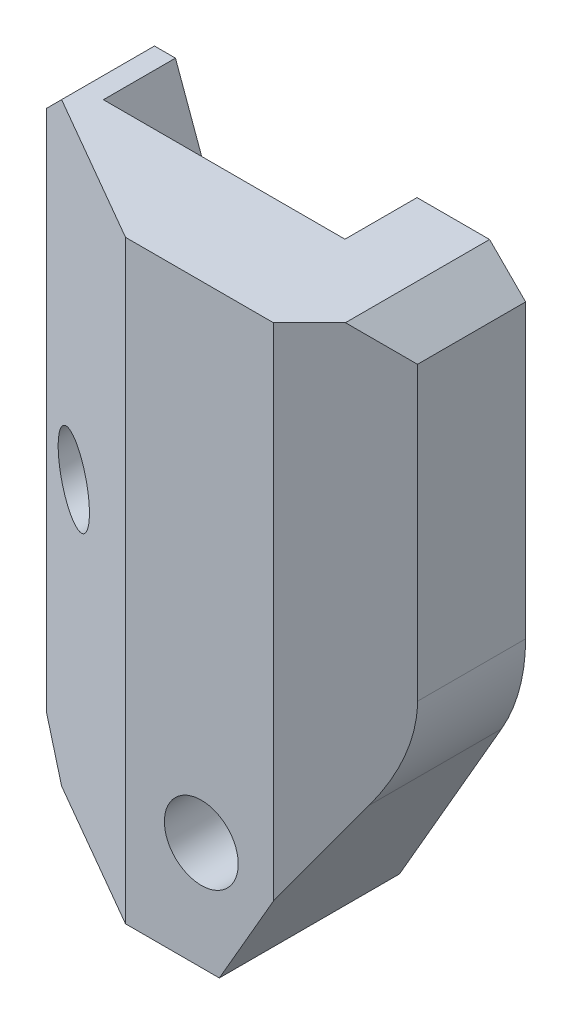
ISO-10303-21;
HEADER;
FILE_DESCRIPTION(('STEP AP214'),'2;1');
FILE_NAME('part.step','',(''),(''),'','','');
FILE_SCHEMA(('AUTOMOTIVE_DESIGN { 1 0 10303 214 1 1 1 1 }'));
ENDSEC;
DATA;
#1=APPLICATION_CONTEXT('core data for automotive mechanical design processes');
#2=APPLICATION_PROTOCOL_DEFINITION('international standard','automotive_design',2000,#1);
#3=PRODUCT_CONTEXT('',#1,'mechanical');
#4=PRODUCT('Part','Part','',(#3));
#5=PRODUCT_RELATED_PRODUCT_CATEGORY('part','',(#4));
#6=PRODUCT_DEFINITION_FORMATION('','',#4);
#7=PRODUCT_DEFINITION_CONTEXT('part definition',#1,'design');
#8=PRODUCT_DEFINITION('design','',#6,#7);
#9=PRODUCT_DEFINITION_SHAPE('','',#8);
#10=(LENGTH_UNIT() NAMED_UNIT(*) SI_UNIT(.MILLI.,.METRE.));
#11=(NAMED_UNIT(*) PLANE_ANGLE_UNIT() SI_UNIT($,.RADIAN.));
#12=(NAMED_UNIT(*) SI_UNIT($,.STERADIAN.) SOLID_ANGLE_UNIT());
#13=UNCERTAINTY_MEASURE_WITH_UNIT(LENGTH_MEASURE(1.E-05),#10,'distance_accuracy_value','');
#14=(GEOMETRIC_REPRESENTATION_CONTEXT(3) GLOBAL_UNCERTAINTY_ASSIGNED_CONTEXT((#13)) GLOBAL_UNIT_ASSIGNED_CONTEXT((#10,
#11,#12)) REPRESENTATION_CONTEXT('',''));
#15=CARTESIAN_POINT('',(0.,0.,0.));
#16=DIRECTION('',(0.,0.,1.));
#17=DIRECTION('',(1.,0.,0.));
#18=AXIS2_PLACEMENT_3D('',#15,#16,#17);
#19=CARTESIAN_POINT('',(-2.49999999999986,-10.,5.));
#20=DIRECTION('',(0.,1.,0.));
#21=DIRECTION('',(0.,0.,1.));
#22=AXIS2_PLACEMENT_3D('',#19,#20,#21);
#23=PLANE('',#22);
#24=DIRECTION('',(0.866025403784436,0.,0.500000000000004));
#25=VECTOR('',#24,1.);
#26=CARTESIAN_POINT('',(-8.79999999999985,-10.,2.));
#27=LINE('',#26,#25);
#28=CARTESIAN_POINT('',(-7.79999999999993,-10.,2.57735026918966));
#29=VERTEX_POINT('',#28);
#30=CARTESIAN_POINT('',(-3.60384757729336,-10.,5.00000000000002));
#31=VERTEX_POINT('',#30);
#32=EDGE_CURVE('E163',#29,#31,#27,.T.);
#33=ORIENTED_EDGE('',*,*,#32,.F.);
#34=DIRECTION('',(0.,0.,-1.));
#35=VECTOR('',#34,1.);
#36=CARTESIAN_POINT('',(-7.79999999999993,-10.,0.));
#37=LINE('',#36,#35);
#38=CARTESIAN_POINT('',(-7.79999999999993,-10.,0.));
#39=VERTEX_POINT('',#38);
#40=EDGE_CURVE('E293',#29,#39,#37,.T.);
#41=ORIENTED_EDGE('',*,*,#40,.T.);
#42=DIRECTION('',(1.,0.,0.));
#43=VECTOR('',#42,1.);
#44=CARTESIAN_POINT('',(-2.49999999999993,-10.,0.));
#45=LINE('',#44,#43);
#46=CARTESIAN_POINT('',(-0.999999999999945,-10.,0.));
#47=VERTEX_POINT('',#46);
#48=EDGE_CURVE('E235',#39,#47,#45,.T.);
#49=ORIENTED_EDGE('',*,*,#48,.T.);
#50=DIRECTION('',(0.,0.,1.));
#51=VECTOR('',#50,1.);
#52=CARTESIAN_POINT('',(-0.999999999999945,-10.,5.));
#53=LINE('',#52,#51);
#54=CARTESIAN_POINT('',(-0.999999999999945,-10.,5.));
#55=VERTEX_POINT('',#54);
#56=EDGE_CURVE('E261',#47,#55,#53,.T.);
#57=ORIENTED_EDGE('',*,*,#56,.T.);
#58=DIRECTION('',(1.,0.,0.));
#59=VECTOR('',#58,1.);
#60=CARTESIAN_POINT('',(-2.49999999999986,-10.,5.));
#61=LINE('',#60,#59);
#62=EDGE_CURVE('E236',#31,#55,#61,.T.);
#63=ORIENTED_EDGE('',*,*,#62,.F.);
#64=EDGE_LOOP('',(#33,#41,#49,#57,#63));
#65=FACE_BOUND('',#64,.T.);
#66=ADVANCED_FACE('F38',(#65),#23,.F.);
#67=CARTESIAN_POINT('',(2.50000000000007,10.,5.));
#68=DIRECTION('',(-1.,0.,0.));
#69=DIRECTION('',(0.,0.,1.));
#70=AXIS2_PLACEMENT_3D('',#67,#68,#69);
#71=PLANE('',#70);
#72=DIRECTION('',(0.,-1.,0.));
#73=VECTOR('',#72,1.);
#74=CARTESIAN_POINT('',(2.50000000000007,-10.,3.00000000000001));
#75=LINE('',#74,#73);
#76=CARTESIAN_POINT('',(2.49999999999999,5.50000000000001,2.99999999999999));
#77=VERTEX_POINT('',#76);
#78=CARTESIAN_POINT('',(2.50000000000007,-2.59807621135331,3.00000000000001));
#79=VERTEX_POINT('',#78);
#80=EDGE_CURVE('E245',#77,#79,#75,.T.);
#81=ORIENTED_EDGE('',*,*,#80,.T.);
#82=DIRECTION('',(0.,0.,1.));
#83=VECTOR('',#82,1.);
#84=CARTESIAN_POINT('',(2.50000000000007,-2.59807621135332,0.));
#85=LINE('',#84,#83);
#86=CARTESIAN_POINT('',(2.50000000000007,-2.59807621135332,0.));
#87=VERTEX_POINT('',#86);
#88=EDGE_CURVE('E295',#79,#87,#85,.F.);
#89=ORIENTED_EDGE('',*,*,#88,.T.);
#90=DIRECTION('',(0.,1.,0.));
#91=VECTOR('',#90,1.);
#92=CARTESIAN_POINT('',(2.50000000000007,10.,0.));
#93=LINE('',#92,#91);
#94=CARTESIAN_POINT('',(2.49999999999999,5.50000000000001,0.));
#95=VERTEX_POINT('',#94);
#96=EDGE_CURVE('E238',#87,#95,#93,.T.);
#97=ORIENTED_EDGE('',*,*,#96,.T.);
#98=DIRECTION('',(0.,0.,1.));
#99=VECTOR('',#98,1.);
#100=CARTESIAN_POINT('',(2.49999999999999,5.49999999999998,5.00000000000002));
#101=LINE('',#100,#99);
#102=EDGE_CURVE('E268',#95,#77,#101,.T.);
#103=ORIENTED_EDGE('',*,*,#102,.T.);
#104=EDGE_LOOP('',(#81,#89,#97,#103));
#105=FACE_BOUND('',#104,.T.);
#106=ADVANCED_FACE('F300',(#105),#71,.F.);
#107=CARTESIAN_POINT('',(-2.49999999999986,-10.,5.));
#108=DIRECTION('',(0.,0.,1.));
#109=DIRECTION('',(1.,0.,0.));
#110=AXIS2_PLACEMENT_3D('',#107,#108,#109);
#111=PLANE('',#110);
#112=DIRECTION('',(0.,1.,0.));
#113=VECTOR('',#112,1.);
#114=CARTESIAN_POINT('',(-3.60384757729343,-16.,5.00000000000002));
#115=LINE('',#114,#113);
#116=CARTESIAN_POINT('',(-3.60384757729335,6.49999999999999,5.));
#117=VERTEX_POINT('',#116);
#118=EDGE_CURVE('E156',#31,#117,#115,.T.);
#119=ORIENTED_EDGE('',*,*,#118,.F.);
#120=ORIENTED_EDGE('',*,*,#62,.T.);
#121=DIRECTION('',(-0.500000000000001,-0.866025403784438,0.));
#122=VECTOR('',#121,1.);
#123=CARTESIAN_POINT('',(-1.37499999999995,-10.6495190528383,5.));
#124=LINE('',#123,#122);
#125=CARTESIAN_POINT('',(0.500000000000153,-7.40192378864667,5.00000000000002));
#126=VERTEX_POINT('',#125);
#127=EDGE_CURVE('E264',#55,#126,#124,.F.);
#128=ORIENTED_EDGE('',*,*,#127,.T.);
#129=DIRECTION('',(0.,1.,0.));
#130=VECTOR('',#129,1.);
#131=CARTESIAN_POINT('',(0.500000000000139,9.99999999999999,5.00000000000002));
#132=LINE('',#131,#130);
#133=CARTESIAN_POINT('',(0.50000000000007,6.49999999999998,5.00000000000002));
#134=VERTEX_POINT('',#133);
#135=EDGE_CURVE('E181',#126,#134,#132,.T.);
#136=ORIENTED_EDGE('',*,*,#135,.T.);
#137=DIRECTION('',(1.,0.,0.));
#138=VECTOR('',#137,1.);
#139=CARTESIAN_POINT('',(-9.29999999999993,6.49999999999998,5.00000000000002));
#140=LINE('',#139,#138);
#141=EDGE_CURVE('E172',#117,#134,#140,.T.);
#142=ORIENTED_EDGE('',*,*,#141,.F.);
#143=EDGE_LOOP('',(#119,#120,#128,#136,#142));
#144=FACE_BOUND('',#143,.T.);
#145=CARTESIAN_POINT('',(-1.49999999999985,-7.00000000000001,5.));
#146=DIRECTION('',(0.,0.,1.));
#147=DIRECTION('',(1.,0.,0.));
#148=AXIS2_PLACEMENT_3D('',#145,#146,#147);
#149=CIRCLE('',#148,1.02499999999999);
#150=CARTESIAN_POINT('',(-0.474999999999859,-7.00000000000001,5.));
#151=VERTEX_POINT('',#150);
#152=EDGE_CURVE('E222',#151,#151,#149,.T.);
#153=ORIENTED_EDGE('',*,*,#152,.F.);
#154=EDGE_LOOP('',(#153));
#155=FACE_BOUND('',#154,.T.);
#156=ADVANCED_FACE('F178',(#144,#155),#111,.T.);
#157=CARTESIAN_POINT('',(-2.49999999999993,-10.,0.));
#158=DIRECTION('',(0.,0.,1.));
#159=DIRECTION('',(1.,0.,0.));
#160=AXIS2_PLACEMENT_3D('',#157,#158,#159);
#161=PLANE('',#160);
#162=ORIENTED_EDGE('',*,*,#96,.F.);
#163=CARTESIAN_POINT('',(-2.5,-2.59807621135331,0.));
#164=DIRECTION('',(0.,0.,1.));
#165=DIRECTION('',(1.,0.,0.));
#166=AXIS2_PLACEMENT_3D('',#163,#164,#165);
#167=CIRCLE('',#166,5.);
#168=CARTESIAN_POINT('',(1.83012701892221,-5.09807621135333,0.));
#169=VERTEX_POINT('',#168);
#170=EDGE_CURVE('E60',#87,#169,#167,.F.);
#171=ORIENTED_EDGE('',*,*,#170,.T.);
#172=DIRECTION('',(0.500000000000001,0.866025403784438,0.));
#173=VECTOR('',#172,1.);
#174=CARTESIAN_POINT('',(2.50000000000006,-3.93782217350894,0.));
#175=LINE('',#174,#173);
#176=EDGE_CURVE('E259',#169,#47,#175,.F.);
#177=ORIENTED_EDGE('',*,*,#176,.T.);
#178=ORIENTED_EDGE('',*,*,#48,.F.);
#179=DIRECTION('',(-0.707106781186548,0.707106781186547,0.));
#180=VECTOR('',#179,1.);
#181=CARTESIAN_POINT('',(-8.79999999999992,-9.,0.));
#182=LINE('',#181,#180);
#183=CARTESIAN_POINT('',(-8.79999999999992,-9.,0.));
#184=VERTEX_POINT('',#183);
#185=EDGE_CURVE('E276',#39,#184,#182,.T.);
#186=ORIENTED_EDGE('',*,*,#185,.T.);
#187=DIRECTION('',(0.,-1.,0.));
#188=VECTOR('',#187,1.);
#189=CARTESIAN_POINT('',(-8.79999999999993,6.50000000000001,0.));
#190=LINE('',#189,#188);
#191=CARTESIAN_POINT('',(-8.79999999999985,5.50000000000001,0.));
#192=VERTEX_POINT('',#191);
#193=EDGE_CURVE('E184',#192,#184,#190,.T.);
#194=ORIENTED_EDGE('',*,*,#193,.F.);
#195=DIRECTION('',(0.70710678118655,0.707106781186546,0.));
#196=VECTOR('',#195,1.);
#197=CARTESIAN_POINT('',(-8.79999999999985,5.50000000000001,0.));
#198=LINE('',#197,#196);
#199=CARTESIAN_POINT('',(-7.8,6.50000000000001,0.));
#200=VERTEX_POINT('',#199);
#201=EDGE_CURVE('E278',#192,#200,#198,.T.);
#202=ORIENTED_EDGE('',*,*,#201,.T.);
#203=DIRECTION('',(-1.,0.,0.));
#204=VECTOR('',#203,1.);
#205=CARTESIAN_POINT('',(-9.29999999999993,6.5,0.));
#206=LINE('',#205,#204);
#207=CARTESIAN_POINT('',(-7.21796650602938,6.50000000000002,0.));
#208=VERTEX_POINT('',#207);
#209=EDGE_CURVE('E183',#208,#200,#206,.T.);
#210=ORIENTED_EDGE('',*,*,#209,.F.);
#211=DIRECTION('',(-0.342020143325669,0.939692620785908,0.));
#212=VECTOR('',#211,1.);
#213=CARTESIAN_POINT('',(-5.99912240044105,3.15125334206073,0.));
#214=LINE('',#213,#212);
#215=CARTESIAN_POINT('',(-3.53657736849615,-3.61453352759782,0.));
#216=VERTEX_POINT('',#215);
#217=EDGE_CURVE('E216',#216,#208,#214,.T.);
#218=ORIENTED_EDGE('',*,*,#217,.F.);
#219=CARTESIAN_POINT('',(-2.59688474771032,-3.27251338427215,0.));
#220=DIRECTION('',(0.,0.,-1.));
#221=DIRECTION('',(1.,0.,0.));
#222=AXIS2_PLACEMENT_3D('',#219,#220,#221);
#223=CIRCLE('',#222,1.);
#224=CARTESIAN_POINT('',(-2.25486460438473,-4.21220600505806,0.));
#225=VERTEX_POINT('',#224);
#226=EDGE_CURVE('E213',#225,#216,#223,.T.);
#227=ORIENTED_EDGE('',*,*,#226,.F.);
#228=DIRECTION('',(-0.939692620785908,-0.34202014332567,0.));
#229=VECTOR('',#228,1.);
#230=CARTESIAN_POINT('',(-2.25486460438473,-4.21220600505806,0.));
#231=LINE('',#230,#229);
#232=CARTESIAN_POINT('',(1.78581366499475,-2.74151938875768,0.));
#233=VERTEX_POINT('',#232);
#234=EDGE_CURVE('E210',#233,#225,#231,.T.);
#235=ORIENTED_EDGE('',*,*,#234,.F.);
#236=CARTESIAN_POINT('',(1.44379352166908,-1.80182676797176,0.));
#237=DIRECTION('',(0.,0.,-1.));
#238=DIRECTION('',(1.,0.,0.));
#239=AXIS2_PLACEMENT_3D('',#236,#237,#238);
#240=CIRCLE('',#239,1.);
#241=CARTESIAN_POINT('',(2.383486142455,-1.4598066246461,0.));
#242=VERTEX_POINT('',#241);
#243=EDGE_CURVE('E193',#242,#233,#240,.T.);
#244=ORIENTED_EDGE('',*,*,#243,.F.);
#245=DIRECTION('',(0.342020143325669,-0.939692620785908,0.));
#246=VECTOR('',#245,1.);
#247=CARTESIAN_POINT('',(2.383486142455,-1.4598066246461,0.));
#248=LINE('',#247,#246);
#249=CARTESIAN_POINT('',(-0.513646539431117,6.50000000000001,0.));
#250=VERTEX_POINT('',#249);
#251=EDGE_CURVE('E198',#250,#242,#248,.T.);
#252=ORIENTED_EDGE('',*,*,#251,.F.);
#253=CARTESIAN_POINT('',(1.50000000000014,6.5,0.));
#254=VERTEX_POINT('',#253);
#255=EDGE_CURVE('E186',#254,#250,#206,.T.);
#256=ORIENTED_EDGE('',*,*,#255,.F.);
#257=DIRECTION('',(-0.707106781186549,0.707106781186546,0.));
#258=VECTOR('',#257,1.);
#259=CARTESIAN_POINT('',(2.49999999999999,5.50000000000001,0.));
#260=LINE('',#259,#258);
#261=EDGE_CURVE('E280',#254,#95,#260,.F.);
#262=ORIENTED_EDGE('',*,*,#261,.T.);
#263=EDGE_LOOP('',(#162,#171,#177,#178,#186,#194,#202,#210,#218,#227,#235,#244,#252,#256,#262));
#264=FACE_BOUND('',#263,.T.);
#265=CARTESIAN_POINT('',(-1.49999999999985,-7.00000000000001,0.));
#266=DIRECTION('',(0.,0.,1.));
#267=DIRECTION('',(1.,0.,0.));
#268=AXIS2_PLACEMENT_3D('',#265,#266,#267);
#269=CIRCLE('',#268,1.02499999999999);
#270=CARTESIAN_POINT('',(-0.47499999999986,-7.00000000000001,0.));
#271=VERTEX_POINT('',#270);
#272=EDGE_CURVE('E231',#271,#271,#269,.T.);
#273=ORIENTED_EDGE('',*,*,#272,.T.);
#274=EDGE_LOOP('',(#273));
#275=FACE_BOUND('',#274,.T.);
#276=CARTESIAN_POINT('',(-6.99999999999994,-2.,0.));
#277=DIRECTION('',(0.,0.,1.));
#278=DIRECTION('',(1.,0.,0.));
#279=AXIS2_PLACEMENT_3D('',#276,#277,#278);
#280=CIRCLE('',#279,1.02499999999999);
#281=CARTESIAN_POINT('',(-5.97499999999995,-2.,0.));
#282=VERTEX_POINT('',#281);
#283=EDGE_CURVE('E232',#282,#282,#280,.T.);
#284=ORIENTED_EDGE('',*,*,#283,.T.);
#285=EDGE_LOOP('',(#284));
#286=FACE_BOUND('',#285,.T.);
#287=ADVANCED_FACE('F304',(#264,#275,#286),#161,.F.);
#288=CARTESIAN_POINT('',(-6.99999999999994,-2.,5.00000000000002));
#289=DIRECTION('',(0.,0.,1.));
#290=DIRECTION('',(1.,0.,0.));
#291=AXIS2_PLACEMENT_3D('',#288,#289,#290);
#292=CYLINDRICAL_SURFACE('',#291,1.02499999999999);
#293=CARTESIAN_POINT('',(-6.99999999999994,-2.,3.03923048454136));
#294=DIRECTION('',(0.500000000000004,0.,-0.866025403784436));
#295=DIRECTION('',(0.866025403784436,0.,0.500000000000004));
#296=AXIS2_PLACEMENT_3D('',#293,#294,#295);
#297=ELLIPSE('',#296,1.18356805183872,1.02499999999999);
#298=CARTESIAN_POINT('',(-5.97499999999995,-2.,3.63101451046072));
#299=VERTEX_POINT('',#298);
#300=EDGE_CURVE('E189',#299,#299,#297,.F.);
#301=ORIENTED_EDGE('',*,*,#300,.T.);
#302=EDGE_LOOP('',(#301));
#303=FACE_BOUND('',#302,.T.);
#304=ORIENTED_EDGE('',*,*,#283,.F.);
#305=EDGE_LOOP('',(#304));
#306=FACE_BOUND('',#305,.T.);
#307=ADVANCED_FACE('F355',(#303,#306),#292,.F.);
#308=CARTESIAN_POINT('',(-1.49999999999985,-7.00000000000001,5.));
#309=DIRECTION('',(0.,0.,1.));
#310=DIRECTION('',(1.,0.,0.));
#311=AXIS2_PLACEMENT_3D('',#308,#309,#310);
#312=CYLINDRICAL_SURFACE('',#311,1.02499999999999);
#313=ORIENTED_EDGE('',*,*,#152,.T.);
#314=EDGE_LOOP('',(#313));
#315=FACE_BOUND('',#314,.T.);
#316=ORIENTED_EDGE('',*,*,#272,.F.);
#317=EDGE_LOOP('',(#316));
#318=FACE_BOUND('',#317,.T.);
#319=ADVANCED_FACE('F388',(#315,#318),#312,.F.);
#320=CARTESIAN_POINT('',(1.44379352166908,-1.80182676797176,2.00000000000002));
#321=DIRECTION('',(0.,0.,-1.));
#322=DIRECTION('',(-1.,0.,0.));
#323=AXIS2_PLACEMENT_3D('',#320,#321,#322);
#324=CYLINDRICAL_SURFACE('',#323,1.);
#325=ORIENTED_EDGE('',*,*,#243,.T.);
#326=DIRECTION('',(0.,0.,-1.));
#327=VECTOR('',#326,1.);
#328=CARTESIAN_POINT('',(1.78581366499476,-2.74151938875769,2.00000000000002));
#329=LINE('',#328,#327);
#330=CARTESIAN_POINT('',(1.78581366499476,-2.74151938875769,2.00000000000002));
#331=VERTEX_POINT('',#330);
#332=EDGE_CURVE('E208',#331,#233,#329,.T.);
#333=ORIENTED_EDGE('',*,*,#332,.F.);
#334=CARTESIAN_POINT('',(1.44379352166908,-1.80182676797176,2.00000000000002));
#335=DIRECTION('',(0.,0.,-1.));
#336=DIRECTION('',(1.,0.,0.));
#337=AXIS2_PLACEMENT_3D('',#334,#335,#336);
#338=CIRCLE('',#337,1.);
#339=CARTESIAN_POINT('',(2.383486142455,-1.4598066246461,2.00000000000002));
#340=VERTEX_POINT('',#339);
#341=EDGE_CURVE('E194',#340,#331,#338,.T.);
#342=ORIENTED_EDGE('',*,*,#341,.F.);
#343=DIRECTION('',(0.,0.,-1.));
#344=VECTOR('',#343,1.);
#345=CARTESIAN_POINT('',(2.383486142455,-1.4598066246461,2.00000000000002));
#346=LINE('',#345,#344);
#347=EDGE_CURVE('E219',#340,#242,#346,.T.);
#348=ORIENTED_EDGE('',*,*,#347,.T.);
#349=EDGE_LOOP('',(#325,#333,#342,#348));
#350=FACE_BOUND('',#349,.T.);
#351=ADVANCED_FACE('F374',(#350),#324,.F.);
#352=CARTESIAN_POINT('',(2.383486142455,-1.4598066246461,2.00000000000002));
#353=DIRECTION('',(0.939692620785908,0.342020143325669,0.));
#354=DIRECTION('',(-0.342020143325669,0.939692620785908,0.));
#355=AXIS2_PLACEMENT_3D('',#352,#353,#354);
#356=PLANE('',#355);
#357=ORIENTED_EDGE('',*,*,#347,.F.);
#358=DIRECTION('',(0.342020143325669,-0.939692620785908,0.));
#359=VECTOR('',#358,1.);
#360=CARTESIAN_POINT('',(2.383486142455,-1.4598066246461,2.00000000000002));
#361=LINE('',#360,#359);
#362=CARTESIAN_POINT('',(-0.513646539431117,6.50000000000001,2.00000000000002));
#363=VERTEX_POINT('',#362);
#364=EDGE_CURVE('E206',#363,#340,#361,.T.);
#365=ORIENTED_EDGE('',*,*,#364,.F.);
#366=DIRECTION('',(0.,0.,1.));
#367=VECTOR('',#366,1.);
#368=CARTESIAN_POINT('',(-0.513646539431048,6.50000000000001,-12.3081273961557));
#369=LINE('',#368,#367);
#370=EDGE_CURVE('E250',#250,#363,#369,.T.);
#371=ORIENTED_EDGE('',*,*,#370,.F.);
#372=ORIENTED_EDGE('',*,*,#251,.T.);
#373=EDGE_LOOP('',(#357,#365,#371,#372));
#374=FACE_BOUND('',#373,.T.);
#375=ADVANCED_FACE('F370',(#374),#356,.F.);
#376=CARTESIAN_POINT('',(-5.99912240044105,3.15125334206073,2.00000000000002));
#377=DIRECTION('',(-0.939692620785908,-0.342020143325669,0.));
#378=DIRECTION('',(0.342020143325669,-0.939692620785908,0.));
#379=AXIS2_PLACEMENT_3D('',#376,#377,#378);
#380=PLANE('',#379);
#381=ORIENTED_EDGE('',*,*,#217,.T.);
#382=DIRECTION('',(0.,0.,-1.));
#383=VECTOR('',#382,1.);
#384=CARTESIAN_POINT('',(-7.21796650602936,6.50000000000001,-12.3081273961557));
#385=LINE('',#384,#383);
#386=CARTESIAN_POINT('',(-7.21796650602938,6.50000000000002,2.00000000000002));
#387=VERTEX_POINT('',#386);
#388=EDGE_CURVE('E256',#387,#208,#385,.T.);
#389=ORIENTED_EDGE('',*,*,#388,.F.);
#390=DIRECTION('',(-0.342020143325669,0.939692620785908,0.));
#391=VECTOR('',#390,1.);
#392=CARTESIAN_POINT('',(-5.99912240044105,3.15125334206073,2.00000000000002));
#393=LINE('',#392,#391);
#394=CARTESIAN_POINT('',(-3.53657736849615,-3.61453352759782,2.00000000000002));
#395=VERTEX_POINT('',#394);
#396=EDGE_CURVE('E204',#395,#387,#393,.T.);
#397=ORIENTED_EDGE('',*,*,#396,.F.);
#398=DIRECTION('',(0.,0.,-1.));
#399=VECTOR('',#398,1.);
#400=CARTESIAN_POINT('',(-3.53657736849615,-3.61453352759782,2.00000000000002));
#401=LINE('',#400,#399);
#402=EDGE_CURVE('E223',#395,#216,#401,.T.);
#403=ORIENTED_EDGE('',*,*,#402,.T.);
#404=EDGE_LOOP('',(#381,#389,#397,#403));
#405=FACE_BOUND('',#404,.T.);
#406=ADVANCED_FACE('F373',(#405),#380,.F.);
#407=CARTESIAN_POINT('',(-2.59688474771032,-3.27251338427215,2.));
#408=DIRECTION('',(0.,0.,-1.));
#409=DIRECTION('',(-1.,0.,0.));
#410=AXIS2_PLACEMENT_3D('',#407,#408,#409);
#411=CYLINDRICAL_SURFACE('',#410,1.);
#412=ORIENTED_EDGE('',*,*,#226,.T.);
#413=ORIENTED_EDGE('',*,*,#402,.F.);
#414=CARTESIAN_POINT('',(-2.59688474771032,-3.27251338427215,2.));
#415=DIRECTION('',(0.,0.,-1.));
#416=DIRECTION('',(1.,0.,0.));
#417=AXIS2_PLACEMENT_3D('',#414,#415,#416);
#418=CIRCLE('',#417,1.);
#419=CARTESIAN_POINT('',(-2.25486460438468,-4.21220600505806,2.));
#420=VERTEX_POINT('',#419);
#421=EDGE_CURVE('E201',#420,#395,#418,.T.);
#422=ORIENTED_EDGE('',*,*,#421,.F.);
#423=DIRECTION('',(0.,0.,-1.));
#424=VECTOR('',#423,1.);
#425=CARTESIAN_POINT('',(-2.25486460438468,-4.21220600505806,2.));
#426=LINE('',#425,#424);
#427=EDGE_CURVE('E225',#420,#225,#426,.T.);
#428=ORIENTED_EDGE('',*,*,#427,.T.);
#429=EDGE_LOOP('',(#412,#413,#422,#428));
#430=FACE_BOUND('',#429,.T.);
#431=ADVANCED_FACE('F378',(#430),#411,.F.);
#432=CARTESIAN_POINT('',(-2.25486460438468,-4.21220600505806,2.));
#433=DIRECTION('',(0.34202014332567,-0.939692620785908,0.));
#434=DIRECTION('',(0.939692620785908,0.34202014332567,0.));
#435=AXIS2_PLACEMENT_3D('',#432,#433,#434);
#436=PLANE('',#435);
#437=ORIENTED_EDGE('',*,*,#234,.T.);
#438=ORIENTED_EDGE('',*,*,#427,.F.);
#439=DIRECTION('',(-0.939692620785908,-0.34202014332567,0.));
#440=VECTOR('',#439,1.);
#441=CARTESIAN_POINT('',(-2.25486460438468,-4.21220600505806,2.));
#442=LINE('',#441,#440);
#443=EDGE_CURVE('E197',#331,#420,#442,.T.);
#444=ORIENTED_EDGE('',*,*,#443,.F.);
#445=ORIENTED_EDGE('',*,*,#332,.T.);
#446=EDGE_LOOP('',(#437,#438,#444,#445));
#447=FACE_BOUND('',#446,.T.);
#448=ADVANCED_FACE('F368',(#447),#436,.F.);
#449=CARTESIAN_POINT('',(1.44379352166908,-1.80182676797176,2.00000000000002));
#450=DIRECTION('',(0.,0.,1.));
#451=DIRECTION('',(1.,0.,0.));
#452=AXIS2_PLACEMENT_3D('',#449,#450,#451);
#453=PLANE('',#452);
#454=DIRECTION('',(-1.,0.,0.));
#455=VECTOR('',#454,1.);
#456=CARTESIAN_POINT('',(-9.29999999999993,6.5,2.00000000000002));
#457=LINE('',#456,#455);
#458=EDGE_CURVE('E253',#363,#387,#457,.T.);
#459=ORIENTED_EDGE('',*,*,#458,.F.);
#460=ORIENTED_EDGE('',*,*,#364,.T.);
#461=ORIENTED_EDGE('',*,*,#341,.T.);
#462=ORIENTED_EDGE('',*,*,#443,.T.);
#463=ORIENTED_EDGE('',*,*,#421,.T.);
#464=ORIENTED_EDGE('',*,*,#396,.T.);
#465=EDGE_LOOP('',(#459,#460,#461,#462,#463,#464));
#466=FACE_BOUND('',#465,.T.);
#467=ADVANCED_FACE('F333',(#466),#453,.F.);
#468=CARTESIAN_POINT('',(0.50000000000007,-10.,5.00000000000002));
#469=DIRECTION('',(0.707106781186549,0.,0.707106781186546));
#470=DIRECTION('',(0.707106781186546,0.,-0.707106781186549));
#471=AXIS2_PLACEMENT_3D('',#468,#469,#470);
#472=PLANE('',#471);
#473=DIRECTION('',(-0.447213595499959,-0.774596669241483,0.44721359549996));
#474=VECTOR('',#473,1.);
#475=CARTESIAN_POINT('',(-0.399999999999942,-8.96076951545868,5.90000000000002));
#476=LINE('',#475,#474);
#477=CARTESIAN_POINT('',(1.83012701892221,-5.09807621135333,3.66987298107782));
#478=VERTEX_POINT('',#477);
#479=EDGE_CURVE('E266',#126,#478,#476,.F.);
#480=ORIENTED_EDGE('',*,*,#479,.T.);
#481=CARTESIAN_POINT('',(-2.49999999999993,-2.59807621135331,8.00000000000001));
#482=DIRECTION('',(0.707106781186549,0.,0.707106781186546));
#483=DIRECTION('',(0.707106781186546,0.,-0.707106781186549));
#484=AXIS2_PLACEMENT_3D('',#481,#482,#483);
#485=ELLIPSE('',#484,7.07106781186549,5.);
#486=EDGE_CURVE('E11',#478,#79,#485,.T.);
#487=ORIENTED_EDGE('',*,*,#486,.T.);
#488=ORIENTED_EDGE('',*,*,#80,.F.);
#489=DIRECTION('',(0.577350269189627,-0.577350269189623,-0.577350269189629));
#490=VECTOR('',#489,1.);
#491=CARTESIAN_POINT('',(6.33333333333337,1.66666666666672,-0.833333333333311));
#492=LINE('',#491,#490);
#493=CARTESIAN_POINT('',(1.50000000000014,6.49999999999998,4.00000000000001));
#494=VERTEX_POINT('',#493);
#495=EDGE_CURVE('E271',#77,#494,#492,.F.);
#496=ORIENTED_EDGE('',*,*,#495,.T.);
#497=DIRECTION('',(0.707106781186546,0.,-0.707106781186549));
#498=VECTOR('',#497,1.);
#499=CARTESIAN_POINT('',(0.50000000000007,6.49999999999998,5.00000000000002));
#500=LINE('',#499,#498);
#501=EDGE_CURVE('E248',#134,#494,#500,.T.);
#502=ORIENTED_EDGE('',*,*,#501,.F.);
#503=ORIENTED_EDGE('',*,*,#135,.F.);
#504=EDGE_LOOP('',(#480,#487,#488,#496,#502,#503));
#505=FACE_BOUND('',#504,.T.);
#506=ADVANCED_FACE('F314',(#505),#472,.T.);
#507=CARTESIAN_POINT('',(-9.29999999999993,6.50000000000001,-12.3081273961557));
#508=DIRECTION('',(0.,-1.,0.));
#509=DIRECTION('',(0.,0.,-1.));
#510=AXIS2_PLACEMENT_3D('',#507,#508,#509);
#511=PLANE('',#510);
#512=ORIENTED_EDGE('',*,*,#501,.T.);
#513=DIRECTION('',(0.,0.,-1.));
#514=VECTOR('',#513,1.);
#515=CARTESIAN_POINT('',(1.50000000000015,6.5,-12.3081273961557));
#516=LINE('',#515,#514);
#517=EDGE_CURVE('E274',#494,#254,#516,.T.);
#518=ORIENTED_EDGE('',*,*,#517,.T.);
#519=ORIENTED_EDGE('',*,*,#255,.T.);
#520=ORIENTED_EDGE('',*,*,#370,.T.);
#521=ORIENTED_EDGE('',*,*,#458,.T.);
#522=ORIENTED_EDGE('',*,*,#388,.T.);
#523=ORIENTED_EDGE('',*,*,#209,.T.);
#524=DIRECTION('',(0.,0.,1.));
#525=VECTOR('',#524,1.);
#526=CARTESIAN_POINT('',(-7.79999999999999,6.50000000000002,2.00000000000002));
#527=LINE('',#526,#525);
#528=CARTESIAN_POINT('',(-7.79999999999999,6.50000000000002,2.57735026918965));
#529=VERTEX_POINT('',#528);
#530=EDGE_CURVE('E176',#200,#529,#527,.T.);
#531=ORIENTED_EDGE('',*,*,#530,.T.);
#532=DIRECTION('',(-0.866025403784436,0.,-0.500000000000004));
#533=VECTOR('',#532,1.);
#534=CARTESIAN_POINT('',(-8.79999999999992,6.50000000000001,2.00000000000002));
#535=LINE('',#534,#533);
#536=EDGE_CURVE('E160',#117,#529,#535,.T.);
#537=ORIENTED_EDGE('',*,*,#536,.F.);
#538=ORIENTED_EDGE('',*,*,#141,.T.);
#539=EDGE_LOOP('',(#512,#518,#519,#520,#521,#522,#523,#531,#537,#538));
#540=FACE_BOUND('',#539,.T.);
#541=ADVANCED_FACE('F171',(#540),#511,.F.);
#542=CARTESIAN_POINT('',(2.50000000000007,-3.93782217350894,5.00000000000002));
#543=DIRECTION('',(-0.866025403784438,0.500000000000001,0.));
#544=DIRECTION('',(-0.500000000000001,-0.866025403784438,0.));
#545=AXIS2_PLACEMENT_3D('',#542,#543,#544);
#546=PLANE('',#545);
#547=ORIENTED_EDGE('',*,*,#176,.F.);
#548=DIRECTION('',(0.,0.,-1.));
#549=VECTOR('',#548,1.);
#550=CARTESIAN_POINT('',(1.83012701892221,-5.09807621135333,3.00000000000001));
#551=LINE('',#550,#549);
#552=EDGE_CURVE('E46',#169,#478,#551,.F.);
#553=ORIENTED_EDGE('',*,*,#552,.T.);
#554=ORIENTED_EDGE('',*,*,#479,.F.);
#555=ORIENTED_EDGE('',*,*,#127,.F.);
#556=ORIENTED_EDGE('',*,*,#56,.F.);
#557=EDGE_LOOP('',(#547,#553,#554,#555,#556));
#558=FACE_BOUND('',#557,.T.);
#559=ADVANCED_FACE('F334',(#558),#546,.F.);
#560=CARTESIAN_POINT('',(-8.79999999999985,-10.,0.));
#561=DIRECTION('',(-1.,0.,0.));
#562=DIRECTION('',(0.,0.,1.));
#563=AXIS2_PLACEMENT_3D('',#560,#561,#562);
#564=PLANE('',#563);
#565=DIRECTION('',(0.,1.,0.));
#566=VECTOR('',#565,1.);
#567=CARTESIAN_POINT('',(-8.79999999999999,-15.9999999999999,2.));
#568=LINE('',#567,#566);
#569=CARTESIAN_POINT('',(-8.79999999999992,-9.,2.));
#570=VERTEX_POINT('',#569);
#571=CARTESIAN_POINT('',(-8.79999999999985,5.50000000000001,2.00000000000002));
#572=VERTEX_POINT('',#571);
#573=EDGE_CURVE('E167',#570,#572,#568,.T.);
#574=ORIENTED_EDGE('',*,*,#573,.T.);
#575=DIRECTION('',(0.,0.,-1.));
#576=VECTOR('',#575,1.);
#577=CARTESIAN_POINT('',(-8.79999999999985,5.50000000000001,0.));
#578=LINE('',#577,#576);
#579=EDGE_CURVE('E286',#572,#192,#578,.T.);
#580=ORIENTED_EDGE('',*,*,#579,.T.);
#581=ORIENTED_EDGE('',*,*,#193,.T.);
#582=DIRECTION('',(0.,0.,1.));
#583=VECTOR('',#582,1.);
#584=CARTESIAN_POINT('',(-8.79999999999992,-9.,2.));
#585=LINE('',#584,#583);
#586=EDGE_CURVE('E283',#184,#570,#585,.T.);
#587=ORIENTED_EDGE('',*,*,#586,.T.);
#588=EDGE_LOOP('',(#574,#580,#581,#587));
#589=FACE_BOUND('',#588,.T.);
#590=ADVANCED_FACE('F337',(#589),#564,.T.);
#591=CARTESIAN_POINT('',(-8.79999999999999,-15.9999999999999,2.));
#592=DIRECTION('',(0.500000000000004,0.,-0.866025403784436));
#593=DIRECTION('',(-0.866025403784436,0.,-0.500000000000004));
#594=AXIS2_PLACEMENT_3D('',#591,#592,#593);
#595=PLANE('',#594);
#596=ORIENTED_EDGE('',*,*,#536,.T.);
#597=DIRECTION('',(-0.654653670707977,-0.654653670707974,-0.377964473009231));
#598=VECTOR('',#597,1.);
#599=CARTESIAN_POINT('',(-9.29487165930533,5.00512834069462,1.71428571428573));
#600=LINE('',#599,#598);
#601=EDGE_CURVE('E291',#529,#572,#600,.T.);
#602=ORIENTED_EDGE('',*,*,#601,.T.);
#603=ORIENTED_EDGE('',*,*,#573,.F.);
#604=DIRECTION('',(0.654653670707977,-0.654653670707976,0.377964473009231));
#605=VECTOR('',#604,1.);
#606=CARTESIAN_POINT('',(-9.29487165930533,-8.5051283406946,1.71428571428571));
#607=LINE('',#606,#605);
#608=EDGE_CURVE('E289',#570,#29,#607,.T.);
#609=ORIENTED_EDGE('',*,*,#608,.T.);
#610=ORIENTED_EDGE('',*,*,#32,.T.);
#611=ORIENTED_EDGE('',*,*,#118,.T.);
#612=EDGE_LOOP('',(#596,#602,#603,#609,#610,#611));
#613=FACE_BOUND('',#612,.T.);
#614=ORIENTED_EDGE('',*,*,#300,.F.);
#615=EDGE_LOOP('',(#614));
#616=FACE_BOUND('',#615,.T.);
#617=ADVANCED_FACE('F158',(#613,#616),#595,.F.);
#618=CARTESIAN_POINT('',(2.49999999999999,5.49999999999998,5.00000000000002));
#619=DIRECTION('',(-0.707106781186546,-0.707106781186549,0.));
#620=DIRECTION('',(0.707106781186549,-0.707106781186546,0.));
#621=AXIS2_PLACEMENT_3D('',#618,#619,#620);
#622=PLANE('',#621);
#623=ORIENTED_EDGE('',*,*,#261,.F.);
#624=ORIENTED_EDGE('',*,*,#517,.F.);
#625=ORIENTED_EDGE('',*,*,#495,.F.);
#626=ORIENTED_EDGE('',*,*,#102,.F.);
#627=EDGE_LOOP('',(#623,#624,#625,#626));
#628=FACE_BOUND('',#627,.T.);
#629=ADVANCED_FACE('F312',(#628),#622,.F.);
#630=CARTESIAN_POINT('',(-8.79999999999985,5.50000000000001,0.));
#631=DIRECTION('',(-0.707106781186546,0.70710678118655,0.));
#632=DIRECTION('',(-0.70710678118655,-0.707106781186546,0.));
#633=AXIS2_PLACEMENT_3D('',#630,#631,#632);
#634=PLANE('',#633);
#635=ORIENTED_EDGE('',*,*,#601,.F.);
#636=ORIENTED_EDGE('',*,*,#530,.F.);
#637=ORIENTED_EDGE('',*,*,#201,.F.);
#638=ORIENTED_EDGE('',*,*,#579,.F.);
#639=EDGE_LOOP('',(#635,#636,#637,#638));
#640=FACE_BOUND('',#639,.T.);
#641=ADVANCED_FACE('F320',(#640),#634,.T.);
#642=CARTESIAN_POINT('',(-8.79999999999992,-9.,0.));
#643=DIRECTION('',(-0.707106781186547,-0.707106781186548,0.));
#644=DIRECTION('',(0.707106781186548,-0.707106781186547,0.));
#645=AXIS2_PLACEMENT_3D('',#642,#643,#644);
#646=PLANE('',#645);
#647=ORIENTED_EDGE('',*,*,#185,.F.);
#648=ORIENTED_EDGE('',*,*,#40,.F.);
#649=ORIENTED_EDGE('',*,*,#608,.F.);
#650=ORIENTED_EDGE('',*,*,#586,.F.);
#651=EDGE_LOOP('',(#647,#648,#649,#650));
#652=FACE_BOUND('',#651,.T.);
#653=ADVANCED_FACE('F316',(#652),#646,.T.);
#654=CARTESIAN_POINT('',(-2.49999999999993,-2.59807621135331,5.));
#655=DIRECTION('',(0.,0.,-1.));
#656=DIRECTION('',(-1.,0.,0.));
#657=AXIS2_PLACEMENT_3D('',#654,#655,#656);
#658=CYLINDRICAL_SURFACE('',#657,5.);
#659=ORIENTED_EDGE('',*,*,#486,.F.);
#660=ORIENTED_EDGE('',*,*,#552,.F.);
#661=ORIENTED_EDGE('',*,*,#170,.F.);
#662=ORIENTED_EDGE('',*,*,#88,.F.);
#663=EDGE_LOOP('',(#659,#660,#661,#662));
#664=FACE_BOUND('',#663,.T.);
#665=ADVANCED_FACE('F40',(#664),#658,.T.);
#666=CLOSED_SHELL('',(#66,#106,#156,#287,#307,#319,#351,#375,#406,#431,#448,#467,#506,#541,#559,
#590,#617,#629,#641,#653,#665));
#667=MANIFOLD_SOLID_BREP('B2',#666);
#668=ADVANCED_BREP_SHAPE_REPRESENTATION('',(#18,#667),#14);
#669=SHAPE_DEFINITION_REPRESENTATION(#9,#668);
ENDSEC;
END-ISO-10303-21;
